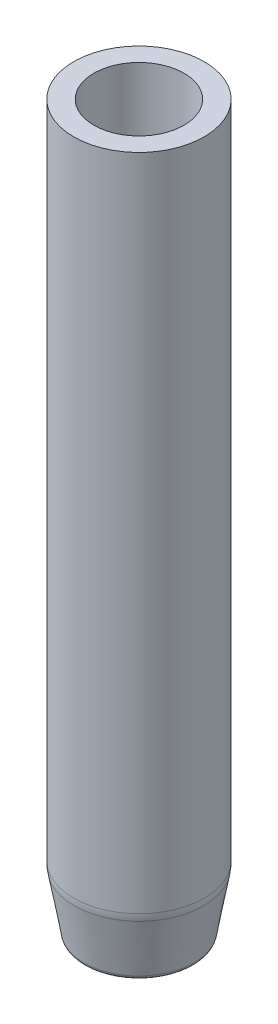
ISO-10303-21;
HEADER;
FILE_DESCRIPTION(('STEP AP214'),'2;1');
FILE_NAME('part.step','',(''),(''),'','','');
FILE_SCHEMA(('AUTOMOTIVE_DESIGN { 1 0 10303 214 1 1 1 1 }'));
ENDSEC;
DATA;
#1=APPLICATION_CONTEXT('core data for automotive mechanical design processes');
#2=APPLICATION_PROTOCOL_DEFINITION('international standard','automotive_design',2000,#1);
#3=PRODUCT_CONTEXT('',#1,'mechanical');
#4=PRODUCT('Part','Part','',(#3));
#5=PRODUCT_RELATED_PRODUCT_CATEGORY('part','',(#4));
#6=PRODUCT_DEFINITION_FORMATION('','',#4);
#7=PRODUCT_DEFINITION_CONTEXT('part definition',#1,'design');
#8=PRODUCT_DEFINITION('design','',#6,#7);
#9=PRODUCT_DEFINITION_SHAPE('','',#8);
#10=(LENGTH_UNIT() NAMED_UNIT(*) SI_UNIT(.MILLI.,.METRE.));
#11=(NAMED_UNIT(*) PLANE_ANGLE_UNIT() SI_UNIT($,.RADIAN.));
#12=(NAMED_UNIT(*) SI_UNIT($,.STERADIAN.) SOLID_ANGLE_UNIT());
#13=UNCERTAINTY_MEASURE_WITH_UNIT(LENGTH_MEASURE(1.E-05),#10,'distance_accuracy_value','');
#14=(GEOMETRIC_REPRESENTATION_CONTEXT(3) GLOBAL_UNCERTAINTY_ASSIGNED_CONTEXT((#13)) GLOBAL_UNIT_ASSIGNED_CONTEXT((#10,
#11,#12)) REPRESENTATION_CONTEXT('',''));
#15=CARTESIAN_POINT('',(0.,0.,0.));
#16=DIRECTION('',(0.,0.,1.));
#17=DIRECTION('',(1.,0.,0.));
#18=AXIS2_PLACEMENT_3D('',#15,#16,#17);
#19=CARTESIAN_POINT('',(0.,-23.4350008415154,0.));
#20=DIRECTION('',(0.,1.,0.));
#21=DIRECTION('',(0.,0.,1.));
#22=AXIS2_PLACEMENT_3D('',#19,#20,#21);
#23=DEGENERATE_TOROIDAL_SURFACE('',#22,1.96849999999999,3.175,.T.);
#24=CARTESIAN_POINT('',(0.,-23.9863338056079,0.));
#25=DIRECTION('',(0.,1.,0.));
#26=DIRECTION('',(0.,0.,1.));
#27=AXIS2_PLACEMENT_3D('',#24,#25,#26);
#28=CIRCLE('',#27,5.09526461581375);
#29=CARTESIAN_POINT('',(0.,-23.9863338056079,5.09526461581375));
#30=VERTEX_POINT('',#29);
#31=EDGE_CURVE('E10',#30,#30,#28,.T.);
#32=ORIENTED_EDGE('',*,*,#31,.T.);
#33=EDGE_LOOP('',(#32));
#34=FACE_BOUND('',#33,.T.);
#35=CARTESIAN_POINT('',(0.,-23.4350008415154,0.));
#36=DIRECTION('',(0.,1.,0.));
#37=DIRECTION('',(0.,0.,1.));
#38=AXIS2_PLACEMENT_3D('',#35,#36,#37);
#39=CIRCLE('',#38,5.14349999999999);
#40=CARTESIAN_POINT('',(0.,-23.4350008415154,5.14349999999999));
#41=VERTEX_POINT('',#40);
#42=EDGE_CURVE('E56',#41,#41,#39,.T.);
#43=ORIENTED_EDGE('',*,*,#42,.F.);
#44=EDGE_LOOP('',(#43));
#45=FACE_BOUND('',#44,.T.);
#46=ADVANCED_FACE('F34',(#34,#45),#23,.T.);
#47=CARTESIAN_POINT('',(0.,-23.9863338056079,0.));
#48=DIRECTION('',(0.,1.,0.));
#49=DIRECTION('',(0.,0.,1.));
#50=AXIS2_PLACEMENT_3D('',#47,#48,#49);
#51=CONICAL_SURFACE('',#50,5.09526461581375,0.174532925199433);
#52=CARTESIAN_POINT('',(0.,-28.2485518497064,0.));
#53=DIRECTION('',(0.,1.,0.));
#54=DIRECTION('',(0.,0.,1.));
#55=AXIS2_PLACEMENT_3D('',#52,#53,#54);
#56=CIRCLE('',#55,4.34372057697672);
#57=CARTESIAN_POINT('',(0.,-28.2485518497064,4.34372057697672));
#58=VERTEX_POINT('',#57);
#59=EDGE_CURVE('E40',#58,#58,#56,.T.);
#60=ORIENTED_EDGE('',*,*,#59,.T.);
#61=EDGE_LOOP('',(#60));
#62=FACE_BOUND('',#61,.T.);
#63=ORIENTED_EDGE('',*,*,#31,.F.);
#64=EDGE_LOOP('',(#63));
#65=FACE_BOUND('',#64,.T.);
#66=ADVANCED_FACE('F64',(#62,#65),#51,.T.);
#67=CARTESIAN_POINT('',(0.,-28.1796352291948,0.));
#68=DIRECTION('',(0.,1.,0.));
#69=DIRECTION('',(0.,0.,1.));
#70=AXIS2_PLACEMENT_3D('',#67,#68,#69);
#71=TOROIDAL_SURFACE('',#70,3.95287499999999,0.396875000000002);
#72=CARTESIAN_POINT('',(0.,-28.1796352291948,0.));
#73=DIRECTION('',(0.,1.,0.));
#74=DIRECTION('',(0.,0.,1.));
#75=AXIS2_PLACEMENT_3D('',#72,#73,#74);
#76=CIRCLE('',#75,3.55599999999999);
#77=CARTESIAN_POINT('',(0.,-28.1796352291948,3.55599999999999));
#78=VERTEX_POINT('',#77);
#79=EDGE_CURVE('E44',#78,#78,#76,.T.);
#80=ORIENTED_EDGE('',*,*,#79,.T.);
#81=EDGE_LOOP('',(#80));
#82=FACE_BOUND('',#81,.T.);
#83=ORIENTED_EDGE('',*,*,#59,.F.);
#84=EDGE_LOOP('',(#83));
#85=FACE_BOUND('',#84,.T.);
#86=ADVANCED_FACE('F68',(#82,#85),#71,.T.);
#87=CARTESIAN_POINT('',(0.,28.575,0.));
#88=DIRECTION('',(0.,1.,0.));
#89=DIRECTION('',(0.,0.,1.));
#90=AXIS2_PLACEMENT_3D('',#87,#88,#89);
#91=CYLINDRICAL_SURFACE('',#90,3.55599999999999);
#92=CARTESIAN_POINT('',(0.,28.575,0.));
#93=DIRECTION('',(0.,1.,0.));
#94=DIRECTION('',(0.,0.,1.));
#95=AXIS2_PLACEMENT_3D('',#92,#93,#94);
#96=CIRCLE('',#95,3.556);
#97=CARTESIAN_POINT('',(0.,28.575,3.556));
#98=VERTEX_POINT('',#97);
#99=EDGE_CURVE('E48',#98,#98,#96,.T.);
#100=ORIENTED_EDGE('',*,*,#99,.T.);
#101=EDGE_LOOP('',(#100));
#102=FACE_BOUND('',#101,.T.);
#103=ORIENTED_EDGE('',*,*,#79,.F.);
#104=EDGE_LOOP('',(#103));
#105=FACE_BOUND('',#104,.T.);
#106=ADVANCED_FACE('F72',(#102,#105),#91,.F.);
#107=CARTESIAN_POINT('',(-3.55600000000001,28.575,0.));
#108=DIRECTION('',(0.,1.,0.));
#109=DIRECTION('',(0.,0.,1.));
#110=AXIS2_PLACEMENT_3D('',#107,#108,#109);
#111=PLANE('',#110);
#112=CARTESIAN_POINT('',(0.,28.575,0.));
#113=DIRECTION('',(0.,1.,0.));
#114=DIRECTION('',(0.,0.,1.));
#115=AXIS2_PLACEMENT_3D('',#112,#113,#114);
#116=CIRCLE('',#115,5.14349999999999);
#117=CARTESIAN_POINT('',(0.,28.575,5.14349999999999));
#118=VERTEX_POINT('',#117);
#119=EDGE_CURVE('E53',#118,#118,#116,.T.);
#120=ORIENTED_EDGE('',*,*,#119,.T.);
#121=EDGE_LOOP('',(#120));
#122=FACE_BOUND('',#121,.T.);
#123=ORIENTED_EDGE('',*,*,#99,.F.);
#124=EDGE_LOOP('',(#123));
#125=FACE_BOUND('',#124,.T.);
#126=ADVANCED_FACE('F79',(#122,#125),#111,.T.);
#127=CARTESIAN_POINT('',(0.,28.575,0.));
#128=DIRECTION('',(0.,1.,0.));
#129=DIRECTION('',(0.,0.,1.));
#130=AXIS2_PLACEMENT_3D('',#127,#128,#129);
#131=CYLINDRICAL_SURFACE('',#130,5.14349999999999);
#132=ORIENTED_EDGE('',*,*,#42,.T.);
#133=EDGE_LOOP('',(#132));
#134=FACE_BOUND('',#133,.T.);
#135=ORIENTED_EDGE('',*,*,#119,.F.);
#136=EDGE_LOOP('',(#135));
#137=FACE_BOUND('',#136,.T.);
#138=ADVANCED_FACE('F60',(#134,#137),#131,.T.);
#139=CLOSED_SHELL('',(#46,#66,#86,#106,#126,#138));
#140=MANIFOLD_SOLID_BREP('B2',#139);
#141=ADVANCED_BREP_SHAPE_REPRESENTATION('',(#18,#140),#14);
#142=SHAPE_DEFINITION_REPRESENTATION(#9,#141);
ENDSEC;
END-ISO-10303-21;
